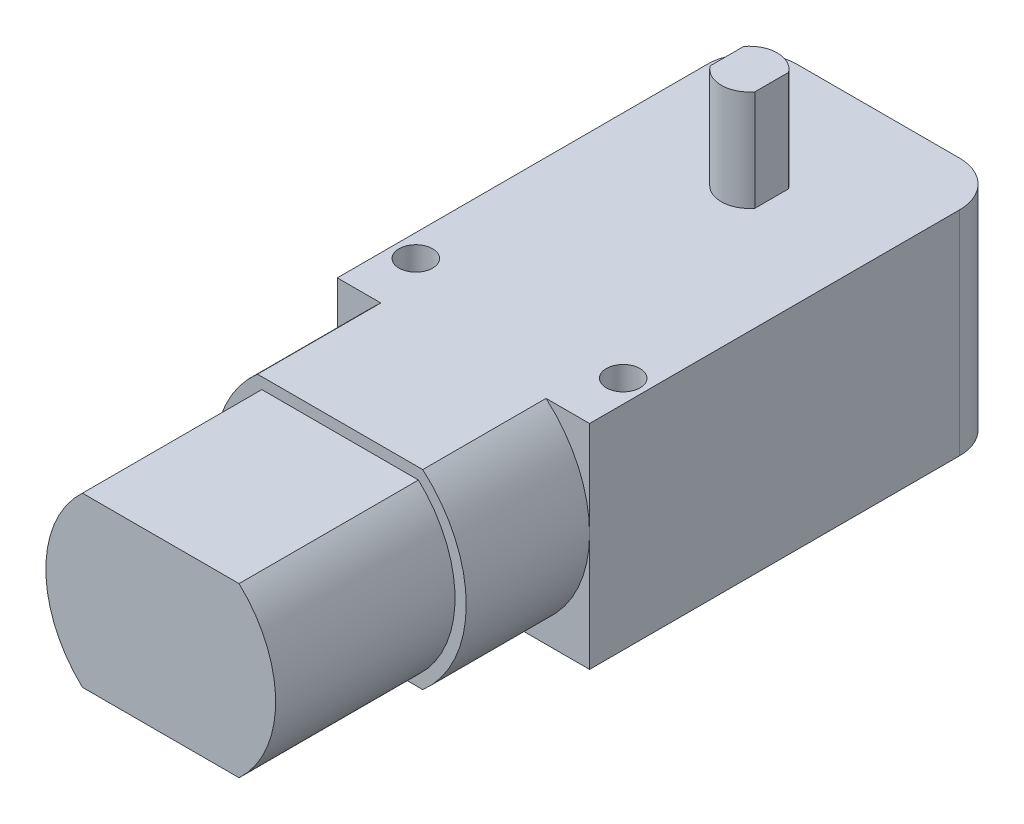
ISO-10303-21;
HEADER;
FILE_DESCRIPTION(('STEP AP214'),'2;1');
FILE_NAME('part.step','',(''),(''),'','','');
FILE_SCHEMA(('AUTOMOTIVE_DESIGN { 1 0 10303 214 1 1 1 1 }'));
ENDSEC;
DATA;
#1=APPLICATION_CONTEXT('core data for automotive mechanical design processes');
#2=APPLICATION_PROTOCOL_DEFINITION('international standard','automotive_design',2000,#1);
#3=PRODUCT_CONTEXT('',#1,'mechanical');
#4=PRODUCT('Part','Part','',(#3));
#5=PRODUCT_RELATED_PRODUCT_CATEGORY('part','',(#4));
#6=PRODUCT_DEFINITION_FORMATION('','',#4);
#7=PRODUCT_DEFINITION_CONTEXT('part definition',#1,'design');
#8=PRODUCT_DEFINITION('design','',#6,#7);
#9=PRODUCT_DEFINITION_SHAPE('','',#8);
#10=(LENGTH_UNIT() NAMED_UNIT(*) SI_UNIT(.MILLI.,.METRE.));
#11=(NAMED_UNIT(*) PLANE_ANGLE_UNIT() SI_UNIT($,.RADIAN.));
#12=(NAMED_UNIT(*) SI_UNIT($,.STERADIAN.) SOLID_ANGLE_UNIT());
#13=UNCERTAINTY_MEASURE_WITH_UNIT(LENGTH_MEASURE(1.E-05),#10,'distance_accuracy_value','');
#14=(GEOMETRIC_REPRESENTATION_CONTEXT(3) GLOBAL_UNCERTAINTY_ASSIGNED_CONTEXT((#13)) GLOBAL_UNIT_ASSIGNED_CONTEXT((#10,
#11,#12)) REPRESENTATION_CONTEXT('',''));
#15=CARTESIAN_POINT('',(0.,0.,0.));
#16=DIRECTION('',(0.,0.,1.));
#17=DIRECTION('',(1.,0.,0.));
#18=AXIS2_PLACEMENT_3D('',#15,#16,#17);
#19=CARTESIAN_POINT('',(11.25,9.5,37.));
#20=DIRECTION('',(0.,-1.,0.));
#21=DIRECTION('',(1.,0.,0.));
#22=AXIS2_PLACEMENT_3D('',#19,#20,#21);
#23=PLANE('',#22);
#24=DIRECTION('',(0.,0.,-1.));
#25=VECTOR('',#24,1.);
#26=CARTESIAN_POINT('',(11.25,9.5,37.));
#27=LINE('',#26,#25);
#28=CARTESIAN_POINT('',(11.25,9.5,37.));
#29=VERTEX_POINT('',#28);
#30=CARTESIAN_POINT('',(11.25,9.5,4.));
#31=VERTEX_POINT('',#30);
#32=EDGE_CURVE('E411',#29,#31,#27,.T.);
#33=ORIENTED_EDGE('',*,*,#32,.T.);
#34=CARTESIAN_POINT('',(7.25,9.5,4.));
#35=DIRECTION('',(0.,-1.,0.));
#36=DIRECTION('',(1.,0.,0.));
#37=AXIS2_PLACEMENT_3D('',#34,#35,#36);
#38=CIRCLE('',#37,4.);
#39=CARTESIAN_POINT('',(7.25,9.5,0.));
#40=VERTEX_POINT('',#39);
#41=EDGE_CURVE('E425',#31,#40,#38,.F.);
#42=ORIENTED_EDGE('',*,*,#41,.T.);
#43=DIRECTION('',(-1.,0.,0.));
#44=VECTOR('',#43,1.);
#45=CARTESIAN_POINT('',(11.25,9.5,0.));
#46=LINE('',#45,#44);
#47=CARTESIAN_POINT('',(-7.24999999999999,9.5,0.));
#48=VERTEX_POINT('',#47);
#49=EDGE_CURVE('E406',#40,#48,#46,.T.);
#50=ORIENTED_EDGE('',*,*,#49,.T.);
#51=CARTESIAN_POINT('',(-7.25,9.5,4.));
#52=DIRECTION('',(0.,-1.,0.));
#53=DIRECTION('',(1.,0.,0.));
#54=AXIS2_PLACEMENT_3D('',#51,#52,#53);
#55=CIRCLE('',#54,4.);
#56=CARTESIAN_POINT('',(-11.25,9.5,4.));
#57=VERTEX_POINT('',#56);
#58=EDGE_CURVE('E423',#48,#57,#55,.F.);
#59=ORIENTED_EDGE('',*,*,#58,.T.);
#60=DIRECTION('',(0.,0.,-1.));
#61=VECTOR('',#60,1.);
#62=CARTESIAN_POINT('',(-11.25,9.5,37.));
#63=LINE('',#62,#61);
#64=CARTESIAN_POINT('',(-11.25,9.5,37.));
#65=VERTEX_POINT('',#64);
#66=EDGE_CURVE('E403',#65,#57,#63,.T.);
#67=ORIENTED_EDGE('',*,*,#66,.F.);
#68=DIRECTION('',(-1.,0.,0.));
#69=VECTOR('',#68,1.);
#70=CARTESIAN_POINT('',(11.25,9.5,37.));
#71=LINE('',#70,#69);
#72=CARTESIAN_POINT('',(-7.36970148649184,9.49999999999999,37.));
#73=VERTEX_POINT('',#72);
#74=EDGE_CURVE('E400',#73,#65,#71,.T.);
#75=ORIENTED_EDGE('',*,*,#74,.F.);
#76=DIRECTION('',(0.,0.,-1.));
#77=VECTOR('',#76,1.);
#78=CARTESIAN_POINT('',(-7.36970148649184,9.5,48.));
#79=LINE('',#78,#77);
#80=CARTESIAN_POINT('',(-7.36970148649184,9.5,48.));
#81=VERTEX_POINT('',#80);
#82=EDGE_CURVE('E383',#81,#73,#79,.T.);
#83=ORIENTED_EDGE('',*,*,#82,.F.);
#84=DIRECTION('',(-1.,0.,0.));
#85=VECTOR('',#84,1.);
#86=CARTESIAN_POINT('',(0.,9.5,48.));
#87=LINE('',#86,#85);
#88=CARTESIAN_POINT('',(7.36970148649183,9.5,48.));
#89=VERTEX_POINT('',#88);
#90=EDGE_CURVE('E361',#89,#81,#87,.T.);
#91=ORIENTED_EDGE('',*,*,#90,.F.);
#92=DIRECTION('',(0.,0.,-1.));
#93=VECTOR('',#92,1.);
#94=CARTESIAN_POINT('',(7.36970148649183,9.5,48.));
#95=LINE('',#94,#93);
#96=CARTESIAN_POINT('',(7.36970148649184,9.5,37.));
#97=VERTEX_POINT('',#96);
#98=EDGE_CURVE('E386',#89,#97,#95,.T.);
#99=ORIENTED_EDGE('',*,*,#98,.T.);
#100=EDGE_CURVE('E401',#29,#97,#71,.T.);
#101=ORIENTED_EDGE('',*,*,#100,.F.);
#102=EDGE_LOOP('',(#33,#42,#50,#59,#67,#75,#83,#91,#99,#101));
#103=FACE_BOUND('',#102,.T.);
#104=CARTESIAN_POINT('',(9.25,9.5,32.));
#105=DIRECTION('',(0.,1.,0.));
#106=DIRECTION('',(-1.,0.,0.));
#107=AXIS2_PLACEMENT_3D('',#104,#105,#106);
#108=CIRCLE('',#107,1.5);
#109=CARTESIAN_POINT('',(7.75,9.5,32.));
#110=VERTEX_POINT('',#109);
#111=EDGE_CURVE('E269',#110,#110,#108,.F.);
#112=ORIENTED_EDGE('',*,*,#111,.T.);
#113=EDGE_LOOP('',(#112));
#114=FACE_BOUND('',#113,.T.);
#115=CARTESIAN_POINT('',(-9.25,9.5,32.));
#116=DIRECTION('',(0.,1.,0.));
#117=DIRECTION('',(-1.,0.,0.));
#118=AXIS2_PLACEMENT_3D('',#115,#116,#117);
#119=CIRCLE('',#118,1.5);
#120=CARTESIAN_POINT('',(-10.75,9.5,32.));
#121=VERTEX_POINT('',#120);
#122=EDGE_CURVE('E282',#121,#121,#119,.T.);
#123=ORIENTED_EDGE('',*,*,#122,.F.);
#124=EDGE_LOOP('',(#123));
#125=FACE_BOUND('',#124,.T.);
#126=CARTESIAN_POINT('',(0.,9.5,11.5));
#127=DIRECTION('',(0.,1.,0.));
#128=DIRECTION('',(-1.,0.,0.));
#129=AXIS2_PLACEMENT_3D('',#126,#127,#128);
#130=CIRCLE('',#129,2.5);
#131=CARTESIAN_POINT('',(2.,9.5,9.99999999999999));
#132=VERTEX_POINT('',#131);
#133=CARTESIAN_POINT('',(-2.,9.5,10.));
#134=VERTEX_POINT('',#133);
#135=EDGE_CURVE('E252',#132,#134,#130,.T.);
#136=ORIENTED_EDGE('',*,*,#135,.F.);
#137=DIRECTION('',(0.,0.,1.));
#138=VECTOR('',#137,1.);
#139=CARTESIAN_POINT('',(2.,9.5,9.99999999999999));
#140=LINE('',#139,#138);
#141=CARTESIAN_POINT('',(2.,9.5,13.));
#142=VERTEX_POINT('',#141);
#143=EDGE_CURVE('E240',#132,#142,#140,.T.);
#144=ORIENTED_EDGE('',*,*,#143,.T.);
#145=CARTESIAN_POINT('',(0.,9.5,11.5));
#146=DIRECTION('',(0.,1.,0.));
#147=DIRECTION('',(-1.,0.,0.));
#148=AXIS2_PLACEMENT_3D('',#145,#146,#147);
#149=CIRCLE('',#148,2.5);
#150=CARTESIAN_POINT('',(-2.,9.5,13.));
#151=VERTEX_POINT('',#150);
#152=EDGE_CURVE('E242',#151,#142,#149,.T.);
#153=ORIENTED_EDGE('',*,*,#152,.F.);
#154=DIRECTION('',(0.,0.,1.));
#155=VECTOR('',#154,1.);
#156=CARTESIAN_POINT('',(-2.,9.5,10.));
#157=LINE('',#156,#155);
#158=EDGE_CURVE('E261',#134,#151,#157,.T.);
#159=ORIENTED_EDGE('',*,*,#158,.F.);
#160=EDGE_LOOP('',(#136,#144,#153,#159));
#161=FACE_BOUND('',#160,.T.);
#162=ADVANCED_FACE('F39',(#103,#114,#125,#161),#23,.F.);
#163=CARTESIAN_POINT('',(11.25,-9.5,37.));
#164=DIRECTION('',(0.,1.,0.));
#165=DIRECTION('',(-1.,0.,0.));
#166=AXIS2_PLACEMENT_3D('',#163,#164,#165);
#167=PLANE('',#166);
#168=DIRECTION('',(0.,0.,-1.));
#169=VECTOR('',#168,1.);
#170=CARTESIAN_POINT('',(-1.99999999999999,-9.5,13.));
#171=LINE('',#170,#169);
#172=CARTESIAN_POINT('',(-2.,-9.5,13.));
#173=VERTEX_POINT('',#172);
#174=CARTESIAN_POINT('',(-2.,-9.5,10.));
#175=VERTEX_POINT('',#174);
#176=EDGE_CURVE('E239',#173,#175,#171,.T.);
#177=ORIENTED_EDGE('',*,*,#176,.F.);
#178=CARTESIAN_POINT('',(0.,-9.5,11.5));
#179=DIRECTION('',(0.,-1.,0.));
#180=DIRECTION('',(1.,0.,0.));
#181=AXIS2_PLACEMENT_3D('',#178,#179,#180);
#182=CIRCLE('',#181,2.5);
#183=CARTESIAN_POINT('',(2.,-9.5,13.));
#184=VERTEX_POINT('',#183);
#185=EDGE_CURVE('E236',#184,#173,#182,.T.);
#186=ORIENTED_EDGE('',*,*,#185,.F.);
#187=DIRECTION('',(0.,0.,-1.));
#188=VECTOR('',#187,1.);
#189=CARTESIAN_POINT('',(2.00000000000001,-9.5,13.));
#190=LINE('',#189,#188);
#191=CARTESIAN_POINT('',(2.00000000000001,-9.5,10.));
#192=VERTEX_POINT('',#191);
#193=EDGE_CURVE('E59',#184,#192,#190,.T.);
#194=ORIENTED_EDGE('',*,*,#193,.T.);
#195=CARTESIAN_POINT('',(0.,-9.5,11.5));
#196=DIRECTION('',(0.,-1.,0.));
#197=DIRECTION('',(1.,0.,0.));
#198=AXIS2_PLACEMENT_3D('',#195,#196,#197);
#199=CIRCLE('',#198,2.5);
#200=EDGE_CURVE('E54',#175,#192,#199,.T.);
#201=ORIENTED_EDGE('',*,*,#200,.F.);
#202=EDGE_LOOP('',(#177,#186,#194,#201));
#203=FACE_BOUND('',#202,.T.);
#204=DIRECTION('',(1.,0.,0.));
#205=VECTOR('',#204,1.);
#206=CARTESIAN_POINT('',(11.25,-9.5,0.));
#207=LINE('',#206,#205);
#208=CARTESIAN_POINT('',(-7.24999999999999,-9.5,0.));
#209=VERTEX_POINT('',#208);
#210=CARTESIAN_POINT('',(7.25,-9.5,0.));
#211=VERTEX_POINT('',#210);
#212=EDGE_CURVE('E389',#209,#211,#207,.T.);
#213=ORIENTED_EDGE('',*,*,#212,.T.);
#214=CARTESIAN_POINT('',(7.25,-9.5,4.));
#215=DIRECTION('',(0.,1.,0.));
#216=DIRECTION('',(-1.,0.,0.));
#217=AXIS2_PLACEMENT_3D('',#214,#215,#216);
#218=CIRCLE('',#217,4.);
#219=CARTESIAN_POINT('',(11.25,-9.5,4.));
#220=VERTEX_POINT('',#219);
#221=EDGE_CURVE('E47',#211,#220,#218,.F.);
#222=ORIENTED_EDGE('',*,*,#221,.T.);
#223=DIRECTION('',(0.,0.,-1.));
#224=VECTOR('',#223,1.);
#225=CARTESIAN_POINT('',(11.25,-9.5,37.));
#226=LINE('',#225,#224);
#227=CARTESIAN_POINT('',(11.25,-9.5,37.));
#228=VERTEX_POINT('',#227);
#229=EDGE_CURVE('E414',#228,#220,#226,.T.);
#230=ORIENTED_EDGE('',*,*,#229,.F.);
#231=DIRECTION('',(1.,0.,0.));
#232=VECTOR('',#231,1.);
#233=CARTESIAN_POINT('',(11.25,-9.5,37.));
#234=LINE('',#233,#232);
#235=CARTESIAN_POINT('',(-11.25,-9.5,37.));
#236=VERTEX_POINT('',#235);
#237=EDGE_CURVE('E393',#236,#228,#234,.T.);
#238=ORIENTED_EDGE('',*,*,#237,.F.);
#239=DIRECTION('',(0.,0.,-1.));
#240=VECTOR('',#239,1.);
#241=CARTESIAN_POINT('',(-11.25,-9.5,37.));
#242=LINE('',#241,#240);
#243=CARTESIAN_POINT('',(-11.25,-9.5,4.));
#244=VERTEX_POINT('',#243);
#245=EDGE_CURVE('E417',#236,#244,#242,.T.);
#246=ORIENTED_EDGE('',*,*,#245,.T.);
#247=CARTESIAN_POINT('',(-7.25,-9.5,4.));
#248=DIRECTION('',(0.,1.,0.));
#249=DIRECTION('',(-1.,0.,0.));
#250=AXIS2_PLACEMENT_3D('',#247,#248,#249);
#251=CIRCLE('',#250,4.);
#252=EDGE_CURVE('E431',#244,#209,#251,.F.);
#253=ORIENTED_EDGE('',*,*,#252,.T.);
#254=EDGE_LOOP('',(#213,#222,#230,#238,#246,#253));
#255=FACE_BOUND('',#254,.T.);
#256=CARTESIAN_POINT('',(9.25,-9.5,32.));
#257=DIRECTION('',(0.,1.,0.));
#258=DIRECTION('',(-1.,0.,0.));
#259=AXIS2_PLACEMENT_3D('',#256,#257,#258);
#260=CIRCLE('',#259,1.5);
#261=CARTESIAN_POINT('',(7.75,-9.5,32.));
#262=VERTEX_POINT('',#261);
#263=EDGE_CURVE('E285',#262,#262,#260,.F.);
#264=ORIENTED_EDGE('',*,*,#263,.F.);
#265=EDGE_LOOP('',(#264));
#266=FACE_BOUND('',#265,.T.);
#267=CARTESIAN_POINT('',(-9.25,-9.5,32.));
#268=DIRECTION('',(0.,1.,0.));
#269=DIRECTION('',(-1.,0.,0.));
#270=AXIS2_PLACEMENT_3D('',#267,#268,#269);
#271=CIRCLE('',#270,1.5);
#272=CARTESIAN_POINT('',(-10.75,-9.5,32.));
#273=VERTEX_POINT('',#272);
#274=EDGE_CURVE('E278',#273,#273,#271,.T.);
#275=ORIENTED_EDGE('',*,*,#274,.T.);
#276=EDGE_LOOP('',(#275));
#277=FACE_BOUND('',#276,.T.);
#278=ADVANCED_FACE('F435',(#203,#255,#266,#277),#167,.F.);
#279=CARTESIAN_POINT('',(0.,0.,0.));
#280=DIRECTION('',(0.,0.,-1.));
#281=DIRECTION('',(-1.,0.,0.));
#282=AXIS2_PLACEMENT_3D('',#279,#280,#281);
#283=PLANE('',#282);
#284=ORIENTED_EDGE('',*,*,#49,.F.);
#285=DIRECTION('',(0.,1.,0.));
#286=VECTOR('',#285,1.);
#287=CARTESIAN_POINT('',(7.25,-9.5,0.));
#288=LINE('',#287,#286);
#289=EDGE_CURVE('E429',#40,#211,#288,.F.);
#290=ORIENTED_EDGE('',*,*,#289,.T.);
#291=ORIENTED_EDGE('',*,*,#212,.F.);
#292=DIRECTION('',(0.,-1.,0.));
#293=VECTOR('',#292,1.);
#294=CARTESIAN_POINT('',(-7.25,9.5,0.));
#295=LINE('',#294,#293);
#296=EDGE_CURVE('E427',#209,#48,#295,.F.);
#297=ORIENTED_EDGE('',*,*,#296,.T.);
#298=EDGE_LOOP('',(#284,#290,#291,#297));
#299=FACE_BOUND('',#298,.T.);
#300=DIRECTION('',(-1.,0.,0.));
#301=VECTOR('',#300,1.);
#302=CARTESIAN_POINT('',(2.48083293175165,-0.499999999999998,0.));
#303=LINE('',#302,#301);
#304=CARTESIAN_POINT('',(2.48083293175165,-0.499999999999998,0.));
#305=VERTEX_POINT('',#304);
#306=CARTESIAN_POINT('',(-2.51916706824835,-0.499999999999998,0.));
#307=VERTEX_POINT('',#306);
#308=EDGE_CURVE('E309',#305,#307,#303,.T.);
#309=ORIENTED_EDGE('',*,*,#308,.F.);
#310=DIRECTION('',(0.,-1.,0.));
#311=VECTOR('',#310,1.);
#312=CARTESIAN_POINT('',(2.48083293175165,-0.499999999999998,0.));
#313=LINE('',#312,#311);
#314=CARTESIAN_POINT('',(2.48083293175165,2.,0.));
#315=VERTEX_POINT('',#314);
#316=EDGE_CURVE('E295',#315,#305,#313,.T.);
#317=ORIENTED_EDGE('',*,*,#316,.F.);
#318=DIRECTION('',(1.,0.,0.));
#319=VECTOR('',#318,1.);
#320=CARTESIAN_POINT('',(2.48083293175165,2.,0.));
#321=LINE('',#320,#319);
#322=CARTESIAN_POINT('',(-2.51916706824835,2.,0.));
#323=VERTEX_POINT('',#322);
#324=EDGE_CURVE('E300',#323,#315,#321,.T.);
#325=ORIENTED_EDGE('',*,*,#324,.F.);
#326=DIRECTION('',(0.,1.,0.));
#327=VECTOR('',#326,1.);
#328=CARTESIAN_POINT('',(-2.51916706824835,-0.499999999999998,0.));
#329=LINE('',#328,#327);
#330=EDGE_CURVE('E311',#307,#323,#329,.T.);
#331=ORIENTED_EDGE('',*,*,#330,.F.);
#332=EDGE_LOOP('',(#309,#317,#325,#331));
#333=FACE_BOUND('',#332,.T.);
#334=ADVANCED_FACE('F454',(#299,#333),#283,.T.);
#335=CARTESIAN_POINT('',(0.,0.,37.));
#336=DIRECTION('',(0.,0.,-1.));
#337=DIRECTION('',(-1.,0.,0.));
#338=AXIS2_PLACEMENT_3D('',#335,#336,#337);
#339=PLANE('',#338);
#340=CARTESIAN_POINT('',(0.,1.,37.));
#341=DIRECTION('',(0.,0.,1.));
#342=DIRECTION('',(1.,0.,0.));
#343=AXIS2_PLACEMENT_3D('',#340,#341,#342);
#344=CIRCLE('',#343,11.25);
#345=CARTESIAN_POINT('',(11.25,1.,37.));
#346=VERTEX_POINT('',#345);
#347=EDGE_CURVE('E372',#346,#97,#344,.T.);
#348=ORIENTED_EDGE('',*,*,#347,.F.);
#349=DIRECTION('',(0.,1.,0.));
#350=VECTOR('',#349,1.);
#351=CARTESIAN_POINT('',(11.25,9.5,37.));
#352=LINE('',#351,#350);
#353=EDGE_CURVE('E396',#346,#29,#352,.T.);
#354=ORIENTED_EDGE('',*,*,#353,.T.);
#355=ORIENTED_EDGE('',*,*,#100,.T.);
#356=EDGE_LOOP('',(#348,#354,#355));
#357=FACE_BOUND('',#356,.T.);
#358=ADVANCED_FACE('F484',(#357),#339,.F.);
#359=CARTESIAN_POINT('',(7.36970148649185,-7.5,37.));
#360=VERTEX_POINT('',#359);
#361=EDGE_CURVE('E357',#360,#346,#344,.T.);
#362=ORIENTED_EDGE('',*,*,#361,.F.);
#363=DIRECTION('',(1.,0.,0.));
#364=VECTOR('',#363,1.);
#365=CARTESIAN_POINT('',(0.,-7.5,37.));
#366=LINE('',#365,#364);
#367=CARTESIAN_POINT('',(-7.36970148649184,-7.5,37.));
#368=VERTEX_POINT('',#367);
#369=EDGE_CURVE('E362',#368,#360,#366,.T.);
#370=ORIENTED_EDGE('',*,*,#369,.F.);
#371=CARTESIAN_POINT('',(0.,1.,37.));
#372=DIRECTION('',(0.,0.,1.));
#373=DIRECTION('',(1.,0.,0.));
#374=AXIS2_PLACEMENT_3D('',#371,#372,#373);
#375=CIRCLE('',#374,11.25);
#376=CARTESIAN_POINT('',(-11.25,0.999999999999999,37.));
#377=VERTEX_POINT('',#376);
#378=EDGE_CURVE('E375',#377,#368,#375,.T.);
#379=ORIENTED_EDGE('',*,*,#378,.F.);
#380=DIRECTION('',(0.,-1.,0.));
#381=VECTOR('',#380,1.);
#382=CARTESIAN_POINT('',(-11.25,9.5,37.));
#383=LINE('',#382,#381);
#384=EDGE_CURVE('E394',#377,#236,#383,.T.);
#385=ORIENTED_EDGE('',*,*,#384,.T.);
#386=ORIENTED_EDGE('',*,*,#237,.T.);
#387=EDGE_CURVE('E397',#228,#346,#352,.T.);
#388=ORIENTED_EDGE('',*,*,#387,.T.);
#389=EDGE_LOOP('',(#362,#370,#379,#385,#386,#388));
#390=FACE_BOUND('',#389,.T.);
#391=ADVANCED_FACE('F486',(#390),#339,.F.);
#392=CARTESIAN_POINT('',(-11.25,9.5,37.));
#393=DIRECTION('',(1.,0.,0.));
#394=DIRECTION('',(0.,1.,0.));
#395=AXIS2_PLACEMENT_3D('',#392,#393,#394);
#396=PLANE('',#395);
#397=ORIENTED_EDGE('',*,*,#66,.T.);
#398=DIRECTION('',(0.,-1.,0.));
#399=VECTOR('',#398,1.);
#400=CARTESIAN_POINT('',(-11.25,-9.5,4.));
#401=LINE('',#400,#399);
#402=EDGE_CURVE('E11',#57,#244,#401,.T.);
#403=ORIENTED_EDGE('',*,*,#402,.T.);
#404=ORIENTED_EDGE('',*,*,#245,.F.);
#405=ORIENTED_EDGE('',*,*,#384,.F.);
#406=EDGE_CURVE('E390',#65,#377,#383,.T.);
#407=ORIENTED_EDGE('',*,*,#406,.F.);
#408=EDGE_LOOP('',(#397,#403,#404,#405,#407));
#409=FACE_BOUND('',#408,.T.);
#410=ADVANCED_FACE('F463',(#409),#396,.F.);
#411=CARTESIAN_POINT('',(11.25,9.5,37.));
#412=DIRECTION('',(-1.,0.,0.));
#413=DIRECTION('',(0.,-1.,0.));
#414=AXIS2_PLACEMENT_3D('',#411,#412,#413);
#415=PLANE('',#414);
#416=ORIENTED_EDGE('',*,*,#229,.T.);
#417=DIRECTION('',(0.,1.,0.));
#418=VECTOR('',#417,1.);
#419=CARTESIAN_POINT('',(11.25,9.5,4.));
#420=LINE('',#419,#418);
#421=EDGE_CURVE('E420',#220,#31,#420,.T.);
#422=ORIENTED_EDGE('',*,*,#421,.T.);
#423=ORIENTED_EDGE('',*,*,#32,.F.);
#424=ORIENTED_EDGE('',*,*,#353,.F.);
#425=ORIENTED_EDGE('',*,*,#387,.F.);
#426=EDGE_LOOP('',(#416,#422,#423,#424,#425));
#427=FACE_BOUND('',#426,.T.);
#428=ADVANCED_FACE('F444',(#427),#415,.F.);
#429=EDGE_CURVE('E371',#73,#377,#375,.T.);
#430=ORIENTED_EDGE('',*,*,#429,.F.);
#431=ORIENTED_EDGE('',*,*,#74,.T.);
#432=ORIENTED_EDGE('',*,*,#406,.T.);
#433=EDGE_LOOP('',(#430,#431,#432));
#434=FACE_BOUND('',#433,.T.);
#435=ADVANCED_FACE('F467',(#434),#339,.F.);
#436=CARTESIAN_POINT('',(0.,1.,48.));
#437=DIRECTION('',(0.,0.,-1.));
#438=DIRECTION('',(-1.,0.,0.));
#439=AXIS2_PLACEMENT_3D('',#436,#437,#438);
#440=CYLINDRICAL_SURFACE('',#439,11.25);
#441=ORIENTED_EDGE('',*,*,#361,.T.);
#442=ORIENTED_EDGE('',*,*,#347,.T.);
#443=ORIENTED_EDGE('',*,*,#98,.F.);
#444=CARTESIAN_POINT('',(0.,1.,48.));
#445=DIRECTION('',(0.,0.,1.));
#446=DIRECTION('',(1.,0.,0.));
#447=AXIS2_PLACEMENT_3D('',#444,#445,#446);
#448=CIRCLE('',#447,11.25);
#449=CARTESIAN_POINT('',(7.36970148649185,-7.5,48.));
#450=VERTEX_POINT('',#449);
#451=EDGE_CURVE('E358',#450,#89,#448,.T.);
#452=ORIENTED_EDGE('',*,*,#451,.F.);
#453=DIRECTION('',(0.,0.,-1.));
#454=VECTOR('',#453,1.);
#455=CARTESIAN_POINT('',(7.36970148649185,-7.5,48.));
#456=LINE('',#455,#454);
#457=EDGE_CURVE('E368',#450,#360,#456,.T.);
#458=ORIENTED_EDGE('',*,*,#457,.T.);
#459=EDGE_LOOP('',(#441,#442,#443,#452,#458));
#460=FACE_BOUND('',#459,.T.);
#461=ADVANCED_FACE('F482',(#460),#440,.T.);
#462=CARTESIAN_POINT('',(0.,1.,48.));
#463=DIRECTION('',(0.,0.,-1.));
#464=DIRECTION('',(-1.,0.,0.));
#465=AXIS2_PLACEMENT_3D('',#462,#463,#464);
#466=CYLINDRICAL_SURFACE('',#465,11.25);
#467=ORIENTED_EDGE('',*,*,#429,.T.);
#468=ORIENTED_EDGE('',*,*,#378,.T.);
#469=DIRECTION('',(0.,0.,-1.));
#470=VECTOR('',#469,1.);
#471=CARTESIAN_POINT('',(-7.36970148649184,-7.5,48.));
#472=LINE('',#471,#470);
#473=CARTESIAN_POINT('',(-7.36970148649184,-7.5,48.));
#474=VERTEX_POINT('',#473);
#475=EDGE_CURVE('E380',#474,#368,#472,.T.);
#476=ORIENTED_EDGE('',*,*,#475,.F.);
#477=CARTESIAN_POINT('',(0.,1.,48.));
#478=DIRECTION('',(0.,0.,1.));
#479=DIRECTION('',(1.,0.,0.));
#480=AXIS2_PLACEMENT_3D('',#477,#478,#479);
#481=CIRCLE('',#480,11.25);
#482=EDGE_CURVE('E364',#81,#474,#481,.T.);
#483=ORIENTED_EDGE('',*,*,#482,.F.);
#484=ORIENTED_EDGE('',*,*,#82,.T.);
#485=EDGE_LOOP('',(#467,#468,#476,#483,#484));
#486=FACE_BOUND('',#485,.T.);
#487=ADVANCED_FACE('F470',(#486),#466,.T.);
#488=CARTESIAN_POINT('',(0.,-7.5,48.));
#489=DIRECTION('',(0.,1.,0.));
#490=DIRECTION('',(0.,0.,1.));
#491=AXIS2_PLACEMENT_3D('',#488,#489,#490);
#492=PLANE('',#491);
#493=ORIENTED_EDGE('',*,*,#369,.T.);
#494=ORIENTED_EDGE('',*,*,#457,.F.);
#495=DIRECTION('',(1.,0.,0.));
#496=VECTOR('',#495,1.);
#497=CARTESIAN_POINT('',(0.,-7.5,48.));
#498=LINE('',#497,#496);
#499=EDGE_CURVE('E366',#474,#450,#498,.T.);
#500=ORIENTED_EDGE('',*,*,#499,.F.);
#501=ORIENTED_EDGE('',*,*,#475,.T.);
#502=EDGE_LOOP('',(#493,#494,#500,#501));
#503=FACE_BOUND('',#502,.T.);
#504=ADVANCED_FACE('F488',(#503),#492,.F.);
#505=CARTESIAN_POINT('',(0.,0.,48.));
#506=DIRECTION('',(0.,0.,1.));
#507=DIRECTION('',(1.,0.,0.));
#508=AXIS2_PLACEMENT_3D('',#505,#506,#507);
#509=PLANE('',#508);
#510=DIRECTION('',(1.,0.,0.));
#511=VECTOR('',#510,1.);
#512=CARTESIAN_POINT('',(0.,-6.5,48.));
#513=LINE('',#512,#511);
#514=CARTESIAN_POINT('',(-6.98659430624106,-6.5,48.));
#515=VERTEX_POINT('',#514);
#516=CARTESIAN_POINT('',(6.98659430624106,-6.5,48.));
#517=VERTEX_POINT('',#516);
#518=EDGE_CURVE('E324',#515,#517,#513,.T.);
#519=ORIENTED_EDGE('',*,*,#518,.F.);
#520=CARTESIAN_POINT('',(0.,1.,48.));
#521=DIRECTION('',(0.,0.,1.));
#522=DIRECTION('',(1.,0.,0.));
#523=AXIS2_PLACEMENT_3D('',#520,#521,#522);
#524=CIRCLE('',#523,10.25);
#525=CARTESIAN_POINT('',(-6.98659430624106,8.5,48.));
#526=VERTEX_POINT('',#525);
#527=EDGE_CURVE('E329',#526,#515,#524,.T.);
#528=ORIENTED_EDGE('',*,*,#527,.F.);
#529=DIRECTION('',(-1.,0.,0.));
#530=VECTOR('',#529,1.);
#531=CARTESIAN_POINT('',(0.,8.5,48.));
#532=LINE('',#531,#530);
#533=CARTESIAN_POINT('',(6.98659430624106,8.5,48.));
#534=VERTEX_POINT('',#533);
#535=EDGE_CURVE('E341',#534,#526,#532,.T.);
#536=ORIENTED_EDGE('',*,*,#535,.F.);
#537=CARTESIAN_POINT('',(0.,1.,48.));
#538=DIRECTION('',(0.,0.,1.));
#539=DIRECTION('',(1.,0.,0.));
#540=AXIS2_PLACEMENT_3D('',#537,#538,#539);
#541=CIRCLE('',#540,10.25);
#542=EDGE_CURVE('E338',#517,#534,#541,.T.);
#543=ORIENTED_EDGE('',*,*,#542,.F.);
#544=EDGE_LOOP('',(#519,#528,#536,#543));
#545=FACE_BOUND('',#544,.T.);
#546=ORIENTED_EDGE('',*,*,#451,.T.);
#547=ORIENTED_EDGE('',*,*,#90,.T.);
#548=ORIENTED_EDGE('',*,*,#482,.T.);
#549=ORIENTED_EDGE('',*,*,#499,.T.);
#550=EDGE_LOOP('',(#546,#547,#548,#549));
#551=FACE_BOUND('',#550,.T.);
#552=ADVANCED_FACE('F477',(#545,#551),#509,.T.);
#553=CARTESIAN_POINT('',(0.,-6.5,64.));
#554=DIRECTION('',(0.,1.,0.));
#555=DIRECTION('',(0.,0.,1.));
#556=AXIS2_PLACEMENT_3D('',#553,#554,#555);
#557=PLANE('',#556);
#558=ORIENTED_EDGE('',*,*,#518,.T.);
#559=DIRECTION('',(0.,0.,-1.));
#560=VECTOR('',#559,1.);
#561=CARTESIAN_POINT('',(6.98659430624106,-6.5,64.));
#562=LINE('',#561,#560);
#563=CARTESIAN_POINT('',(6.98659430624106,-6.5,64.));
#564=VERTEX_POINT('',#563);
#565=EDGE_CURVE('E354',#564,#517,#562,.T.);
#566=ORIENTED_EDGE('',*,*,#565,.F.);
#567=DIRECTION('',(1.,0.,0.));
#568=VECTOR('',#567,1.);
#569=CARTESIAN_POINT('',(0.,-6.5,64.));
#570=LINE('',#569,#568);
#571=CARTESIAN_POINT('',(-6.98659430624106,-6.5,64.));
#572=VERTEX_POINT('',#571);
#573=EDGE_CURVE('E325',#572,#564,#570,.T.);
#574=ORIENTED_EDGE('',*,*,#573,.F.);
#575=DIRECTION('',(0.,0.,-1.));
#576=VECTOR('',#575,1.);
#577=CARTESIAN_POINT('',(-6.98659430624106,-6.5,64.));
#578=LINE('',#577,#576);
#579=EDGE_CURVE('E335',#572,#515,#578,.T.);
#580=ORIENTED_EDGE('',*,*,#579,.T.);
#581=EDGE_LOOP('',(#558,#566,#574,#580));
#582=FACE_BOUND('',#581,.T.);
#583=ADVANCED_FACE('F495',(#582),#557,.F.);
#584=CARTESIAN_POINT('',(0.,1.,64.));
#585=DIRECTION('',(0.,0.,-1.));
#586=DIRECTION('',(-1.,0.,0.));
#587=AXIS2_PLACEMENT_3D('',#584,#585,#586);
#588=CYLINDRICAL_SURFACE('',#587,10.25);
#589=ORIENTED_EDGE('',*,*,#542,.T.);
#590=DIRECTION('',(0.,0.,-1.));
#591=VECTOR('',#590,1.);
#592=CARTESIAN_POINT('',(6.98659430624106,8.5,64.));
#593=LINE('',#592,#591);
#594=CARTESIAN_POINT('',(6.98659430624106,8.5,64.));
#595=VERTEX_POINT('',#594);
#596=EDGE_CURVE('E351',#595,#534,#593,.T.);
#597=ORIENTED_EDGE('',*,*,#596,.F.);
#598=CARTESIAN_POINT('',(0.,1.,64.));
#599=DIRECTION('',(0.,0.,1.));
#600=DIRECTION('',(1.,0.,0.));
#601=AXIS2_PLACEMENT_3D('',#598,#599,#600);
#602=CIRCLE('',#601,10.25);
#603=EDGE_CURVE('E328',#564,#595,#602,.T.);
#604=ORIENTED_EDGE('',*,*,#603,.F.);
#605=ORIENTED_EDGE('',*,*,#565,.T.);
#606=EDGE_LOOP('',(#589,#597,#604,#605));
#607=FACE_BOUND('',#606,.T.);
#608=ADVANCED_FACE('F532',(#607),#588,.T.);
#609=CARTESIAN_POINT('',(0.,8.5,64.));
#610=DIRECTION('',(0.,-1.,0.));
#611=DIRECTION('',(0.,0.,-1.));
#612=AXIS2_PLACEMENT_3D('',#609,#610,#611);
#613=PLANE('',#612);
#614=ORIENTED_EDGE('',*,*,#535,.T.);
#615=DIRECTION('',(0.,0.,-1.));
#616=VECTOR('',#615,1.);
#617=CARTESIAN_POINT('',(-6.98659430624106,8.5,64.));
#618=LINE('',#617,#616);
#619=CARTESIAN_POINT('',(-6.98659430624106,8.5,64.));
#620=VERTEX_POINT('',#619);
#621=EDGE_CURVE('E348',#620,#526,#618,.T.);
#622=ORIENTED_EDGE('',*,*,#621,.F.);
#623=DIRECTION('',(-1.,0.,0.));
#624=VECTOR('',#623,1.);
#625=CARTESIAN_POINT('',(0.,8.5,64.));
#626=LINE('',#625,#624);
#627=EDGE_CURVE('E331',#595,#620,#626,.T.);
#628=ORIENTED_EDGE('',*,*,#627,.F.);
#629=ORIENTED_EDGE('',*,*,#596,.T.);
#630=EDGE_LOOP('',(#614,#622,#628,#629));
#631=FACE_BOUND('',#630,.T.);
#632=ADVANCED_FACE('F524',(#631),#613,.F.);
#633=CARTESIAN_POINT('',(0.,1.,64.));
#634=DIRECTION('',(0.,0.,-1.));
#635=DIRECTION('',(-1.,0.,0.));
#636=AXIS2_PLACEMENT_3D('',#633,#634,#635);
#637=CYLINDRICAL_SURFACE('',#636,10.25);
#638=ORIENTED_EDGE('',*,*,#527,.T.);
#639=ORIENTED_EDGE('',*,*,#579,.F.);
#640=CARTESIAN_POINT('',(0.,1.,64.));
#641=DIRECTION('',(0.,0.,1.));
#642=DIRECTION('',(1.,0.,0.));
#643=AXIS2_PLACEMENT_3D('',#640,#641,#642);
#644=CIRCLE('',#643,10.25);
#645=EDGE_CURVE('E333',#620,#572,#644,.T.);
#646=ORIENTED_EDGE('',*,*,#645,.F.);
#647=ORIENTED_EDGE('',*,*,#621,.T.);
#648=EDGE_LOOP('',(#638,#639,#646,#647));
#649=FACE_BOUND('',#648,.T.);
#650=ADVANCED_FACE('F518',(#649),#637,.T.);
#651=CARTESIAN_POINT('',(0.,0.,64.));
#652=DIRECTION('',(0.,0.,1.));
#653=DIRECTION('',(1.,0.,0.));
#654=AXIS2_PLACEMENT_3D('',#651,#652,#653);
#655=PLANE('',#654);
#656=ORIENTED_EDGE('',*,*,#573,.T.);
#657=ORIENTED_EDGE('',*,*,#603,.T.);
#658=ORIENTED_EDGE('',*,*,#627,.T.);
#659=ORIENTED_EDGE('',*,*,#645,.T.);
#660=EDGE_LOOP('',(#656,#657,#658,#659));
#661=FACE_BOUND('',#660,.T.);
#662=ADVANCED_FACE('F512',(#661),#655,.T.);
#663=CARTESIAN_POINT('',(7.25,9.5,4.));
#664=DIRECTION('',(0.,-1.,0.));
#665=DIRECTION('',(1.,0.,0.));
#666=AXIS2_PLACEMENT_3D('',#663,#664,#665);
#667=CYLINDRICAL_SURFACE('',#666,4.);
#668=ORIENTED_EDGE('',*,*,#221,.F.);
#669=ORIENTED_EDGE('',*,*,#289,.F.);
#670=ORIENTED_EDGE('',*,*,#41,.F.);
#671=ORIENTED_EDGE('',*,*,#421,.F.);
#672=EDGE_LOOP('',(#668,#669,#670,#671));
#673=FACE_BOUND('',#672,.T.);
#674=ADVANCED_FACE('F447',(#673),#667,.T.);
#675=CARTESIAN_POINT('',(-7.25,9.5,4.));
#676=DIRECTION('',(0.,1.,0.));
#677=DIRECTION('',(-1.,0.,0.));
#678=AXIS2_PLACEMENT_3D('',#675,#676,#677);
#679=CYLINDRICAL_SURFACE('',#678,4.);
#680=ORIENTED_EDGE('',*,*,#58,.F.);
#681=ORIENTED_EDGE('',*,*,#296,.F.);
#682=ORIENTED_EDGE('',*,*,#252,.F.);
#683=ORIENTED_EDGE('',*,*,#402,.F.);
#684=EDGE_LOOP('',(#680,#681,#682,#683));
#685=FACE_BOUND('',#684,.T.);
#686=ADVANCED_FACE('F41',(#685),#679,.T.);
#687=CARTESIAN_POINT('',(2.48083293175165,-0.499999999999998,-5.));
#688=DIRECTION('',(-1.,0.,0.));
#689=DIRECTION('',(0.,0.,1.));
#690=AXIS2_PLACEMENT_3D('',#687,#688,#689);
#691=PLANE('',#690);
#692=ORIENTED_EDGE('',*,*,#316,.T.);
#693=DIRECTION('',(0.,0.,1.));
#694=VECTOR('',#693,1.);
#695=CARTESIAN_POINT('',(2.48083293175165,-0.499999999999998,-5.));
#696=LINE('',#695,#694);
#697=CARTESIAN_POINT('',(2.48083293175165,-0.499999999999998,-5.));
#698=VERTEX_POINT('',#697);
#699=EDGE_CURVE('E322',#698,#305,#696,.T.);
#700=ORIENTED_EDGE('',*,*,#699,.F.);
#701=DIRECTION('',(0.,-1.,0.));
#702=VECTOR('',#701,1.);
#703=CARTESIAN_POINT('',(2.48083293175165,-0.499999999999998,-5.));
#704=LINE('',#703,#702);
#705=CARTESIAN_POINT('',(2.48083293175165,2.,-5.));
#706=VERTEX_POINT('',#705);
#707=EDGE_CURVE('E296',#706,#698,#704,.T.);
#708=ORIENTED_EDGE('',*,*,#707,.F.);
#709=DIRECTION('',(0.,0.,1.));
#710=VECTOR('',#709,1.);
#711=CARTESIAN_POINT('',(2.48083293175165,2.,-5.));
#712=LINE('',#711,#710);
#713=EDGE_CURVE('E306',#706,#315,#712,.T.);
#714=ORIENTED_EDGE('',*,*,#713,.T.);
#715=EDGE_LOOP('',(#692,#700,#708,#714));
#716=FACE_BOUND('',#715,.T.);
#717=ADVANCED_FACE('F517',(#716),#691,.F.);
#718=CARTESIAN_POINT('',(2.48083293175165,-0.499999999999998,-5.));
#719=DIRECTION('',(0.,1.,0.));
#720=DIRECTION('',(0.,0.,1.));
#721=AXIS2_PLACEMENT_3D('',#718,#719,#720);
#722=PLANE('',#721);
#723=CARTESIAN_POINT('',(-0.00958353412417482,-0.499999999999998,-2.5));
#724=DIRECTION('',(0.,1.,0.));
#725=DIRECTION('',(0.,0.,1.));
#726=AXIS2_PLACEMENT_3D('',#723,#724,#725);
#727=CIRCLE('',#726,1.5);
#728=CARTESIAN_POINT('',(-0.00958353412417482,-0.499999999999998,-1.));
#729=VERTEX_POINT('',#728);
#730=EDGE_CURVE('E292',#729,#729,#727,.T.);
#731=ORIENTED_EDGE('',*,*,#730,.T.);
#732=EDGE_LOOP('',(#731));
#733=FACE_BOUND('',#732,.T.);
#734=ORIENTED_EDGE('',*,*,#308,.T.);
#735=DIRECTION('',(0.,0.,1.));
#736=VECTOR('',#735,1.);
#737=CARTESIAN_POINT('',(-2.51916706824835,-0.499999999999998,-5.));
#738=LINE('',#737,#736);
#739=CARTESIAN_POINT('',(-2.51916706824835,-0.499999999999998,-5.));
#740=VERTEX_POINT('',#739);
#741=EDGE_CURVE('E319',#740,#307,#738,.T.);
#742=ORIENTED_EDGE('',*,*,#741,.F.);
#743=DIRECTION('',(-1.,0.,0.));
#744=VECTOR('',#743,1.);
#745=CARTESIAN_POINT('',(2.48083293175165,-0.499999999999998,-5.));
#746=LINE('',#745,#744);
#747=EDGE_CURVE('E299',#698,#740,#746,.T.);
#748=ORIENTED_EDGE('',*,*,#747,.F.);
#749=ORIENTED_EDGE('',*,*,#699,.T.);
#750=EDGE_LOOP('',(#734,#742,#748,#749));
#751=FACE_BOUND('',#750,.T.);
#752=ADVANCED_FACE('F615',(#733,#751),#722,.F.);
#753=CARTESIAN_POINT('',(-2.51916706824835,-0.499999999999998,-5.));
#754=DIRECTION('',(1.,0.,0.));
#755=DIRECTION('',(0.,0.,-1.));
#756=AXIS2_PLACEMENT_3D('',#753,#754,#755);
#757=PLANE('',#756);
#758=ORIENTED_EDGE('',*,*,#330,.T.);
#759=DIRECTION('',(0.,0.,1.));
#760=VECTOR('',#759,1.);
#761=CARTESIAN_POINT('',(-2.51916706824835,2.,-5.));
#762=LINE('',#761,#760);
#763=CARTESIAN_POINT('',(-2.51916706824835,2.,-5.));
#764=VERTEX_POINT('',#763);
#765=EDGE_CURVE('E317',#764,#323,#762,.T.);
#766=ORIENTED_EDGE('',*,*,#765,.F.);
#767=DIRECTION('',(0.,1.,0.));
#768=VECTOR('',#767,1.);
#769=CARTESIAN_POINT('',(-2.51916706824835,-0.499999999999998,-5.));
#770=LINE('',#769,#768);
#771=EDGE_CURVE('E302',#740,#764,#770,.T.);
#772=ORIENTED_EDGE('',*,*,#771,.F.);
#773=ORIENTED_EDGE('',*,*,#741,.T.);
#774=EDGE_LOOP('',(#758,#766,#772,#773));
#775=FACE_BOUND('',#774,.T.);
#776=ADVANCED_FACE('F622',(#775),#757,.F.);
#777=CARTESIAN_POINT('',(2.48083293175165,2.,-5.));
#778=DIRECTION('',(0.,-1.,0.));
#779=DIRECTION('',(1.,0.,0.));
#780=AXIS2_PLACEMENT_3D('',#777,#778,#779);
#781=PLANE('',#780);
#782=CARTESIAN_POINT('',(-0.00958353412417504,2.,-2.5));
#783=DIRECTION('',(0.,1.,0.));
#784=DIRECTION('',(-1.,0.,0.));
#785=AXIS2_PLACEMENT_3D('',#782,#783,#784);
#786=CIRCLE('',#785,1.5);
#787=CARTESIAN_POINT('',(-1.50958353412418,2.,-2.5));
#788=VERTEX_POINT('',#787);
#789=EDGE_CURVE('E281',#788,#788,#786,.T.);
#790=ORIENTED_EDGE('',*,*,#789,.F.);
#791=EDGE_LOOP('',(#790));
#792=FACE_BOUND('',#791,.T.);
#793=ORIENTED_EDGE('',*,*,#324,.T.);
#794=ORIENTED_EDGE('',*,*,#713,.F.);
#795=DIRECTION('',(1.,0.,0.));
#796=VECTOR('',#795,1.);
#797=CARTESIAN_POINT('',(2.48083293175165,2.,-5.));
#798=LINE('',#797,#796);
#799=EDGE_CURVE('E304',#764,#706,#798,.T.);
#800=ORIENTED_EDGE('',*,*,#799,.F.);
#801=ORIENTED_EDGE('',*,*,#765,.T.);
#802=EDGE_LOOP('',(#793,#794,#800,#801));
#803=FACE_BOUND('',#802,.T.);
#804=ADVANCED_FACE('F627',(#792,#803),#781,.F.);
#805=CARTESIAN_POINT('',(0.,0.,-5.));
#806=DIRECTION('',(0.,0.,1.));
#807=DIRECTION('',(1.,0.,0.));
#808=AXIS2_PLACEMENT_3D('',#805,#806,#807);
#809=PLANE('',#808);
#810=ORIENTED_EDGE('',*,*,#707,.T.);
#811=ORIENTED_EDGE('',*,*,#747,.T.);
#812=ORIENTED_EDGE('',*,*,#771,.T.);
#813=ORIENTED_EDGE('',*,*,#799,.T.);
#814=EDGE_LOOP('',(#810,#811,#812,#813));
#815=FACE_BOUND('',#814,.T.);
#816=ADVANCED_FACE('F636',(#815),#809,.F.);
#817=CARTESIAN_POINT('',(-0.00958353412417461,-3.,-2.5));
#818=DIRECTION('',(0.,1.,0.));
#819=DIRECTION('',(-1.,0.,0.));
#820=AXIS2_PLACEMENT_3D('',#817,#818,#819);
#821=CYLINDRICAL_SURFACE('',#820,1.5);
#822=ORIENTED_EDGE('',*,*,#789,.T.);
#823=EDGE_LOOP('',(#822));
#824=FACE_BOUND('',#823,.T.);
#825=ORIENTED_EDGE('',*,*,#730,.F.);
#826=EDGE_LOOP('',(#825));
#827=FACE_BOUND('',#826,.T.);
#828=ADVANCED_FACE('F641',(#824,#827),#821,.F.);
#829=CARTESIAN_POINT('',(9.25,-9.5,32.));
#830=DIRECTION('',(0.,1.,0.));
#831=DIRECTION('',(-1.,0.,0.));
#832=AXIS2_PLACEMENT_3D('',#829,#830,#831);
#833=CYLINDRICAL_SURFACE('',#832,1.5);
#834=ORIENTED_EDGE('',*,*,#263,.T.);
#835=EDGE_LOOP('',(#834));
#836=FACE_BOUND('',#835,.T.);
#837=ORIENTED_EDGE('',*,*,#111,.F.);
#838=EDGE_LOOP('',(#837));
#839=FACE_BOUND('',#838,.T.);
#840=ADVANCED_FACE('F667',(#836,#839),#833,.F.);
#841=CARTESIAN_POINT('',(-9.25,-9.5,32.));
#842=DIRECTION('',(0.,1.,0.));
#843=DIRECTION('',(-1.,0.,0.));
#844=AXIS2_PLACEMENT_3D('',#841,#842,#843);
#845=CYLINDRICAL_SURFACE('',#844,1.5);
#846=ORIENTED_EDGE('',*,*,#274,.F.);
#847=EDGE_LOOP('',(#846));
#848=FACE_BOUND('',#847,.T.);
#849=ORIENTED_EDGE('',*,*,#122,.T.);
#850=EDGE_LOOP('',(#849));
#851=FACE_BOUND('',#850,.T.);
#852=ADVANCED_FACE('F679',(#848,#851),#845,.F.);
#853=CARTESIAN_POINT('',(2.,18.5,9.99999999999999));
#854=DIRECTION('',(1.,0.,0.));
#855=DIRECTION('',(0.,1.,0.));
#856=AXIS2_PLACEMENT_3D('',#853,#854,#855);
#857=PLANE('',#856);
#858=ORIENTED_EDGE('',*,*,#143,.F.);
#859=DIRECTION('',(0.,-1.,0.));
#860=VECTOR('',#859,1.);
#861=CARTESIAN_POINT('',(2.,18.5,9.99999999999999));
#862=LINE('',#861,#860);
#863=CARTESIAN_POINT('',(2.,18.5,9.99999999999999));
#864=VERTEX_POINT('',#863);
#865=EDGE_CURVE('E266',#864,#132,#862,.T.);
#866=ORIENTED_EDGE('',*,*,#865,.F.);
#867=DIRECTION('',(0.,0.,1.));
#868=VECTOR('',#867,1.);
#869=CARTESIAN_POINT('',(2.,18.5,9.99999999999999));
#870=LINE('',#869,#868);
#871=CARTESIAN_POINT('',(2.,18.5,13.));
#872=VERTEX_POINT('',#871);
#873=EDGE_CURVE('E248',#864,#872,#870,.T.);
#874=ORIENTED_EDGE('',*,*,#873,.T.);
#875=DIRECTION('',(0.,-1.,0.));
#876=VECTOR('',#875,1.);
#877=CARTESIAN_POINT('',(2.,18.5,13.));
#878=LINE('',#877,#876);
#879=EDGE_CURVE('E257',#872,#142,#878,.T.);
#880=ORIENTED_EDGE('',*,*,#879,.T.);
#881=EDGE_LOOP('',(#858,#866,#874,#880));
#882=FACE_BOUND('',#881,.T.);
#883=ADVANCED_FACE('F689',(#882),#857,.T.);
#884=CARTESIAN_POINT('',(0.,18.5,11.5));
#885=DIRECTION('',(0.,-1.,0.));
#886=DIRECTION('',(1.,0.,0.));
#887=AXIS2_PLACEMENT_3D('',#884,#885,#886);
#888=CYLINDRICAL_SURFACE('',#887,2.5);
#889=ORIENTED_EDGE('',*,*,#135,.T.);
#890=DIRECTION('',(0.,-1.,0.));
#891=VECTOR('',#890,1.);
#892=CARTESIAN_POINT('',(-2.,18.5,10.));
#893=LINE('',#892,#891);
#894=CARTESIAN_POINT('',(-2.,18.5,10.));
#895=VERTEX_POINT('',#894);
#896=EDGE_CURVE('E270',#895,#134,#893,.T.);
#897=ORIENTED_EDGE('',*,*,#896,.F.);
#898=CARTESIAN_POINT('',(0.,18.5,11.5));
#899=DIRECTION('',(0.,1.,0.));
#900=DIRECTION('',(-1.,0.,0.));
#901=AXIS2_PLACEMENT_3D('',#898,#899,#900);
#902=CIRCLE('',#901,2.5);
#903=EDGE_CURVE('E256',#864,#895,#902,.T.);
#904=ORIENTED_EDGE('',*,*,#903,.F.);
#905=ORIENTED_EDGE('',*,*,#865,.T.);
#906=EDGE_LOOP('',(#889,#897,#904,#905));
#907=FACE_BOUND('',#906,.T.);
#908=ADVANCED_FACE('F707',(#907),#888,.T.);
#909=CARTESIAN_POINT('',(-2.,18.5,10.));
#910=DIRECTION('',(1.,0.,0.));
#911=DIRECTION('',(0.,1.,0.));
#912=AXIS2_PLACEMENT_3D('',#909,#910,#911);
#913=PLANE('',#912);
#914=ORIENTED_EDGE('',*,*,#158,.T.);
#915=DIRECTION('',(0.,-1.,0.));
#916=VECTOR('',#915,1.);
#917=CARTESIAN_POINT('',(-2.,18.5,13.));
#918=LINE('',#917,#916);
#919=CARTESIAN_POINT('',(-2.,18.5,13.));
#920=VERTEX_POINT('',#919);
#921=EDGE_CURVE('E273',#920,#151,#918,.T.);
#922=ORIENTED_EDGE('',*,*,#921,.F.);
#923=DIRECTION('',(0.,0.,1.));
#924=VECTOR('',#923,1.);
#925=CARTESIAN_POINT('',(-2.,18.5,10.));
#926=LINE('',#925,#924);
#927=EDGE_CURVE('E254',#895,#920,#926,.T.);
#928=ORIENTED_EDGE('',*,*,#927,.F.);
#929=ORIENTED_EDGE('',*,*,#896,.T.);
#930=EDGE_LOOP('',(#914,#922,#928,#929));
#931=FACE_BOUND('',#930,.T.);
#932=ADVANCED_FACE('F718',(#931),#913,.F.);
#933=CARTESIAN_POINT('',(0.,18.5,11.5));
#934=DIRECTION('',(0.,-1.,0.));
#935=DIRECTION('',(1.,0.,0.));
#936=AXIS2_PLACEMENT_3D('',#933,#934,#935);
#937=CYLINDRICAL_SURFACE('',#936,2.5);
#938=ORIENTED_EDGE('',*,*,#152,.T.);
#939=ORIENTED_EDGE('',*,*,#879,.F.);
#940=CARTESIAN_POINT('',(0.,18.5,11.5));
#941=DIRECTION('',(0.,1.,0.));
#942=DIRECTION('',(-1.,0.,0.));
#943=AXIS2_PLACEMENT_3D('',#940,#941,#942);
#944=CIRCLE('',#943,2.5);
#945=EDGE_CURVE('E251',#920,#872,#944,.T.);
#946=ORIENTED_EDGE('',*,*,#945,.F.);
#947=ORIENTED_EDGE('',*,*,#921,.T.);
#948=EDGE_LOOP('',(#938,#939,#946,#947));
#949=FACE_BOUND('',#948,.T.);
#950=ADVANCED_FACE('F729',(#949),#937,.T.);
#951=CARTESIAN_POINT('',(0.,18.5,11.5));
#952=DIRECTION('',(0.,1.,0.));
#953=DIRECTION('',(-1.,0.,0.));
#954=AXIS2_PLACEMENT_3D('',#951,#952,#953);
#955=PLANE('',#954);
#956=ORIENTED_EDGE('',*,*,#873,.F.);
#957=ORIENTED_EDGE('',*,*,#903,.T.);
#958=ORIENTED_EDGE('',*,*,#927,.T.);
#959=ORIENTED_EDGE('',*,*,#945,.T.);
#960=EDGE_LOOP('',(#956,#957,#958,#959));
#961=FACE_BOUND('',#960,.T.);
#962=ADVANCED_FACE('F740',(#961),#955,.T.);
#963=CARTESIAN_POINT('',(-1.99999999999999,-18.5,13.));
#964=DIRECTION('',(1.,0.,0.));
#965=DIRECTION('',(0.,1.,0.));
#966=AXIS2_PLACEMENT_3D('',#963,#964,#965);
#967=PLANE('',#966);
#968=ORIENTED_EDGE('',*,*,#176,.T.);
#969=DIRECTION('',(0.,1.,0.));
#970=VECTOR('',#969,1.);
#971=CARTESIAN_POINT('',(-1.99999999999999,-18.5,10.));
#972=LINE('',#971,#970);
#973=CARTESIAN_POINT('',(-1.99999999999999,-18.5,10.));
#974=VERTEX_POINT('',#973);
#975=EDGE_CURVE('E220',#974,#175,#972,.T.);
#976=ORIENTED_EDGE('',*,*,#975,.F.);
#977=DIRECTION('',(0.,0.,-1.));
#978=VECTOR('',#977,1.);
#979=CARTESIAN_POINT('',(-1.99999999999999,-18.5,13.));
#980=LINE('',#979,#978);
#981=CARTESIAN_POINT('',(-2.,-18.5,13.));
#982=VERTEX_POINT('',#981);
#983=EDGE_CURVE('E227',#982,#974,#980,.T.);
#984=ORIENTED_EDGE('',*,*,#983,.F.);
#985=DIRECTION('',(0.,1.,0.));
#986=VECTOR('',#985,1.);
#987=CARTESIAN_POINT('',(-2.,-18.5,13.));
#988=LINE('',#987,#986);
#989=EDGE_CURVE('E830',#982,#173,#988,.T.);
#990=ORIENTED_EDGE('',*,*,#989,.T.);
#991=EDGE_LOOP('',(#968,#976,#984,#990));
#992=FACE_BOUND('',#991,.T.);
#993=ADVANCED_FACE('F238',(#992),#967,.F.);
#994=CARTESIAN_POINT('',(0.,-18.5,11.5));
#995=DIRECTION('',(0.,1.,0.));
#996=DIRECTION('',(-1.,0.,0.));
#997=AXIS2_PLACEMENT_3D('',#994,#995,#996);
#998=CYLINDRICAL_SURFACE('',#997,2.5);
#999=ORIENTED_EDGE('',*,*,#200,.T.);
#1000=DIRECTION('',(0.,1.,0.));
#1001=VECTOR('',#1000,1.);
#1002=CARTESIAN_POINT('',(2.00000000000001,-18.5,10.));
#1003=LINE('',#1002,#1001);
#1004=CARTESIAN_POINT('',(2.00000000000001,-18.5,10.));
#1005=VERTEX_POINT('',#1004);
#1006=EDGE_CURVE('E222',#1005,#192,#1003,.T.);
#1007=ORIENTED_EDGE('',*,*,#1006,.F.);
#1008=CARTESIAN_POINT('',(0.,-18.5,11.5));
#1009=DIRECTION('',(0.,-1.,0.));
#1010=DIRECTION('',(1.,0.,0.));
#1011=AXIS2_PLACEMENT_3D('',#1008,#1009,#1010);
#1012=CIRCLE('',#1011,2.5);
#1013=EDGE_CURVE('E216',#974,#1005,#1012,.T.);
#1014=ORIENTED_EDGE('',*,*,#1013,.F.);
#1015=ORIENTED_EDGE('',*,*,#975,.T.);
#1016=EDGE_LOOP('',(#999,#1007,#1014,#1015));
#1017=FACE_BOUND('',#1016,.T.);
#1018=ADVANCED_FACE('F218',(#1017),#998,.T.);
#1019=CARTESIAN_POINT('',(2.00000000000001,-18.5,13.));
#1020=DIRECTION('',(1.,0.,0.));
#1021=DIRECTION('',(0.,1.,0.));
#1022=AXIS2_PLACEMENT_3D('',#1019,#1020,#1021);
#1023=PLANE('',#1022);
#1024=ORIENTED_EDGE('',*,*,#193,.F.);
#1025=DIRECTION('',(0.,1.,0.));
#1026=VECTOR('',#1025,1.);
#1027=CARTESIAN_POINT('',(2.00000000000001,-18.5,13.));
#1028=LINE('',#1027,#1026);
#1029=CARTESIAN_POINT('',(2.00000000000001,-18.5,13.));
#1030=VERTEX_POINT('',#1029);
#1031=EDGE_CURVE('E244',#1030,#184,#1028,.T.);
#1032=ORIENTED_EDGE('',*,*,#1031,.F.);
#1033=DIRECTION('',(0.,0.,-1.));
#1034=VECTOR('',#1033,1.);
#1035=CARTESIAN_POINT('',(2.00000000000001,-18.5,13.));
#1036=LINE('',#1035,#1034);
#1037=EDGE_CURVE('E226',#1030,#1005,#1036,.T.);
#1038=ORIENTED_EDGE('',*,*,#1037,.T.);
#1039=ORIENTED_EDGE('',*,*,#1006,.T.);
#1040=EDGE_LOOP('',(#1024,#1032,#1038,#1039));
#1041=FACE_BOUND('',#1040,.T.);
#1042=ADVANCED_FACE('F775',(#1041),#1023,.T.);
#1043=CARTESIAN_POINT('',(0.,-18.5,11.5));
#1044=DIRECTION('',(0.,1.,0.));
#1045=DIRECTION('',(-1.,0.,0.));
#1046=AXIS2_PLACEMENT_3D('',#1043,#1044,#1045);
#1047=CYLINDRICAL_SURFACE('',#1046,2.5);
#1048=ORIENTED_EDGE('',*,*,#185,.T.);
#1049=ORIENTED_EDGE('',*,*,#989,.F.);
#1050=CARTESIAN_POINT('',(0.,-18.5,11.5));
#1051=DIRECTION('',(0.,-1.,0.));
#1052=DIRECTION('',(1.,0.,0.));
#1053=AXIS2_PLACEMENT_3D('',#1050,#1051,#1052);
#1054=CIRCLE('',#1053,2.5);
#1055=EDGE_CURVE('E232',#1030,#982,#1054,.T.);
#1056=ORIENTED_EDGE('',*,*,#1055,.F.);
#1057=ORIENTED_EDGE('',*,*,#1031,.T.);
#1058=EDGE_LOOP('',(#1048,#1049,#1056,#1057));
#1059=FACE_BOUND('',#1058,.T.);
#1060=ADVANCED_FACE('F785',(#1059),#1047,.T.);
#1061=CARTESIAN_POINT('',(0.,-18.5,11.5));
#1062=DIRECTION('',(0.,-1.,0.));
#1063=DIRECTION('',(1.,0.,0.));
#1064=AXIS2_PLACEMENT_3D('',#1061,#1062,#1063);
#1065=PLANE('',#1064);
#1066=ORIENTED_EDGE('',*,*,#983,.T.);
#1067=ORIENTED_EDGE('',*,*,#1013,.T.);
#1068=ORIENTED_EDGE('',*,*,#1037,.F.);
#1069=ORIENTED_EDGE('',*,*,#1055,.T.);
#1070=EDGE_LOOP('',(#1066,#1067,#1068,#1069));
#1071=FACE_BOUND('',#1070,.T.);
#1072=ADVANCED_FACE('F230',(#1071),#1065,.T.);
#1073=CLOSED_SHELL('',(#162,#278,#334,#358,#391,#410,#428,#435,#461,#487,#504,#552,#583,#608,
#632,#650,#662,#674,#686,#717,#752,#776,#804,#816,#828,#840,#852,#883,#908,#932,#950,#962,#993,
#1018,#1042,#1060,#1072));
#1074=MANIFOLD_SOLID_BREP('B2',#1073);
#1075=ADVANCED_BREP_SHAPE_REPRESENTATION('',(#18,#1074),#14);
#1076=SHAPE_DEFINITION_REPRESENTATION(#9,#1075);
ENDSEC;
END-ISO-10303-21;
